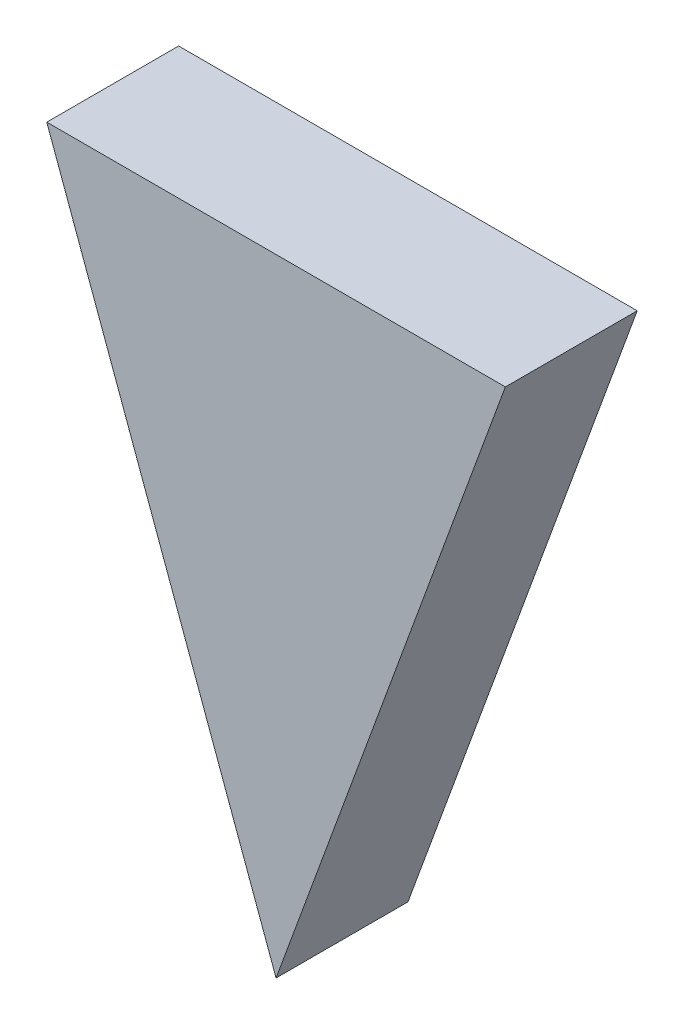
ISO-10303-21;
HEADER;
FILE_DESCRIPTION(('STEP AP214'),'2;1');
FILE_NAME('part.step','',(''),(''),'','','');
FILE_SCHEMA(('AUTOMOTIVE_DESIGN { 1 0 10303 214 1 1 1 1 }'));
ENDSEC;
DATA;
#1=APPLICATION_CONTEXT('core data for automotive mechanical design processes');
#2=APPLICATION_PROTOCOL_DEFINITION('international standard','automotive_design',2000,#1);
#3=PRODUCT_CONTEXT('',#1,'mechanical');
#4=PRODUCT('Part','Part','',(#3));
#5=PRODUCT_RELATED_PRODUCT_CATEGORY('part','',(#4));
#6=PRODUCT_DEFINITION_FORMATION('','',#4);
#7=PRODUCT_DEFINITION_CONTEXT('part definition',#1,'design');
#8=PRODUCT_DEFINITION('design','',#6,#7);
#9=PRODUCT_DEFINITION_SHAPE('','',#8);
#10=(LENGTH_UNIT() NAMED_UNIT(*) SI_UNIT(.MILLI.,.METRE.));
#11=(NAMED_UNIT(*) PLANE_ANGLE_UNIT() SI_UNIT($,.RADIAN.));
#12=(NAMED_UNIT(*) SI_UNIT($,.STERADIAN.) SOLID_ANGLE_UNIT());
#13=UNCERTAINTY_MEASURE_WITH_UNIT(LENGTH_MEASURE(1.E-05),#10,'distance_accuracy_value','');
#14=(GEOMETRIC_REPRESENTATION_CONTEXT(3) GLOBAL_UNCERTAINTY_ASSIGNED_CONTEXT((#13)) GLOBAL_UNIT_ASSIGNED_CONTEXT((#10,
#11,#12)) REPRESENTATION_CONTEXT('',''));
#15=CARTESIAN_POINT('',(0.,0.,0.));
#16=DIRECTION('',(0.,0.,1.));
#17=DIRECTION('',(1.,0.,0.));
#18=AXIS2_PLACEMENT_3D('',#15,#16,#17);
#19=CARTESIAN_POINT('',(-0.518853858518795,-2.989237744231,0.));
#20=DIRECTION('',(0.,1.,0.));
#21=DIRECTION('',(-1.,0.,0.));
#22=AXIS2_PLACEMENT_3D('',#19,#20,#21);
#23=PLANE('',#22);
#24=DIRECTION('',(1.,0.,0.));
#25=VECTOR('',#24,1.);
#26=CARTESIAN_POINT('',(-0.866633755873621,-2.989237744231,0.));
#27=LINE('',#26,#25);
#28=CARTESIAN_POINT('',(-0.866633755873621,-2.989237744231,0.));
#29=VERTEX_POINT('',#28);
#30=CARTESIAN_POINT('',(-0.518853858518795,-2.989237744231,0.));
#31=VERTEX_POINT('',#30);
#32=EDGE_CURVE('E11',#29,#31,#27,.T.);
#33=ORIENTED_EDGE('',*,*,#32,.F.);
#34=DIRECTION('',(0.,0.,1.));
#35=VECTOR('',#34,1.);
#36=CARTESIAN_POINT('',(-0.866633755873621,-2.989237744231,0.));
#37=LINE('',#36,#35);
#38=CARTESIAN_POINT('',(-0.866633755873621,-2.989237744231,0.1));
#39=VERTEX_POINT('',#38);
#40=EDGE_CURVE('E24',#29,#39,#37,.T.);
#41=ORIENTED_EDGE('',*,*,#40,.T.);
#42=DIRECTION('',(-1.,0.,0.));
#43=VECTOR('',#42,1.);
#44=CARTESIAN_POINT('',(-0.866633755873621,-2.989237744231,0.1));
#45=LINE('',#44,#43);
#46=CARTESIAN_POINT('',(-0.518853858518795,-2.989237744231,0.1));
#47=VERTEX_POINT('',#46);
#48=EDGE_CURVE('E67',#47,#39,#45,.T.);
#49=ORIENTED_EDGE('',*,*,#48,.F.);
#50=DIRECTION('',(0.,0.,1.));
#51=VECTOR('',#50,1.);
#52=CARTESIAN_POINT('',(-0.518853858518795,-2.989237744231,0.));
#53=LINE('',#52,#51);
#54=EDGE_CURVE('E54',#31,#47,#53,.T.);
#55=ORIENTED_EDGE('',*,*,#54,.F.);
#56=EDGE_LOOP('',(#33,#41,#49,#55));
#57=FACE_BOUND('',#56,.T.);
#58=ADVANCED_FACE('F17',(#57),#23,.T.);
#59=CARTESIAN_POINT('',(-0.692743807196202,-3.464403198123,0.));
#60=DIRECTION('',(0.939091646326952,-0.343666815097029,0.));
#61=DIRECTION('',(0.343666815097029,0.939091646326952,0.));
#62=AXIS2_PLACEMENT_3D('',#59,#60,#61);
#63=PLANE('',#62);
#64=DIRECTION('',(-0.343666815097029,-0.939091646326952,0.));
#65=VECTOR('',#64,1.);
#66=CARTESIAN_POINT('',(-0.513776654504948,-2.975363958149,0.));
#67=LINE('',#66,#65);
#68=CARTESIAN_POINT('',(-0.692743807196202,-3.464403198123,0.));
#69=VERTEX_POINT('',#68);
#70=EDGE_CURVE('E58',#31,#69,#67,.T.);
#71=ORIENTED_EDGE('',*,*,#70,.F.);
#72=ORIENTED_EDGE('',*,*,#54,.T.);
#73=DIRECTION('',(0.343666815097029,0.939091646326952,0.));
#74=VECTOR('',#73,1.);
#75=CARTESIAN_POINT('',(-0.513776654504948,-2.975363958149,0.1));
#76=LINE('',#75,#74);
#77=CARTESIAN_POINT('',(-0.692743807196202,-3.464403198123,0.1));
#78=VERTEX_POINT('',#77);
#79=EDGE_CURVE('E48',#78,#47,#76,.T.);
#80=ORIENTED_EDGE('',*,*,#79,.F.);
#81=DIRECTION('',(0.,0.,1.));
#82=VECTOR('',#81,1.);
#83=CARTESIAN_POINT('',(-0.692743807196202,-3.464403198123,0.));
#84=LINE('',#83,#82);
#85=EDGE_CURVE('E52',#69,#78,#84,.T.);
#86=ORIENTED_EDGE('',*,*,#85,.F.);
#87=EDGE_LOOP('',(#71,#72,#80,#86));
#88=FACE_BOUND('',#87,.T.);
#89=ADVANCED_FACE('F51',(#88),#63,.T.);
#90=CARTESIAN_POINT('',(-0.866633755873621,-2.989237744231,0.));
#91=DIRECTION('',(-0.939091646326944,-0.34366681509705,0.));
#92=DIRECTION('',(0.34366681509705,-0.939091646326944,0.));
#93=AXIS2_PLACEMENT_3D('',#90,#91,#92);
#94=PLANE('',#93);
#95=DIRECTION('',(-0.34366681509705,0.939091646326944,0.));
#96=VECTOR('',#95,1.);
#97=CARTESIAN_POINT('',(-0.692743807196202,-3.464403198123,0.));
#98=LINE('',#97,#96);
#99=EDGE_CURVE('E64',#69,#29,#98,.T.);
#100=ORIENTED_EDGE('',*,*,#99,.F.);
#101=ORIENTED_EDGE('',*,*,#85,.T.);
#102=DIRECTION('',(0.34366681509705,-0.939091646326944,0.));
#103=VECTOR('',#102,1.);
#104=CARTESIAN_POINT('',(-0.692743807196202,-3.464403198123,0.1));
#105=LINE('',#104,#103);
#106=EDGE_CURVE('E63',#39,#78,#105,.T.);
#107=ORIENTED_EDGE('',*,*,#106,.F.);
#108=ORIENTED_EDGE('',*,*,#40,.F.);
#109=EDGE_LOOP('',(#100,#101,#107,#108));
#110=FACE_BOUND('',#109,.T.);
#111=ADVANCED_FACE('F62',(#110),#94,.T.);
#112=CARTESIAN_POINT('',(-0.692743807196206,-3.166054440362,0.));
#113=DIRECTION('',(0.,0.,1.));
#114=DIRECTION('',(1.,0.,0.));
#115=AXIS2_PLACEMENT_3D('',#112,#113,#114);
#116=PLANE('',#115);
#117=ORIENTED_EDGE('',*,*,#99,.T.);
#118=ORIENTED_EDGE('',*,*,#32,.T.);
#119=ORIENTED_EDGE('',*,*,#70,.T.);
#120=EDGE_LOOP('',(#117,#118,#119));
#121=FACE_BOUND('',#120,.T.);
#122=ADVANCED_FACE('F73',(#121),#116,.F.);
#123=CARTESIAN_POINT('',(-0.692743807196206,-3.166054440362,0.1));
#124=DIRECTION('',(0.,0.,1.));
#125=DIRECTION('',(1.,0.,0.));
#126=AXIS2_PLACEMENT_3D('',#123,#124,#125);
#127=PLANE('',#126);
#128=ORIENTED_EDGE('',*,*,#106,.T.);
#129=ORIENTED_EDGE('',*,*,#79,.T.);
#130=ORIENTED_EDGE('',*,*,#48,.T.);
#131=EDGE_LOOP('',(#128,#129,#130));
#132=FACE_BOUND('',#131,.T.);
#133=ADVANCED_FACE('F66',(#132),#127,.T.);
#134=CLOSED_SHELL('',(#58,#89,#111,#122,#133));
#135=MANIFOLD_SOLID_BREP('B1',#134);
#136=ADVANCED_BREP_SHAPE_REPRESENTATION('',(#18,#135),#14);
#137=SHAPE_DEFINITION_REPRESENTATION(#9,#136);
ENDSEC;
END-ISO-10303-21;
